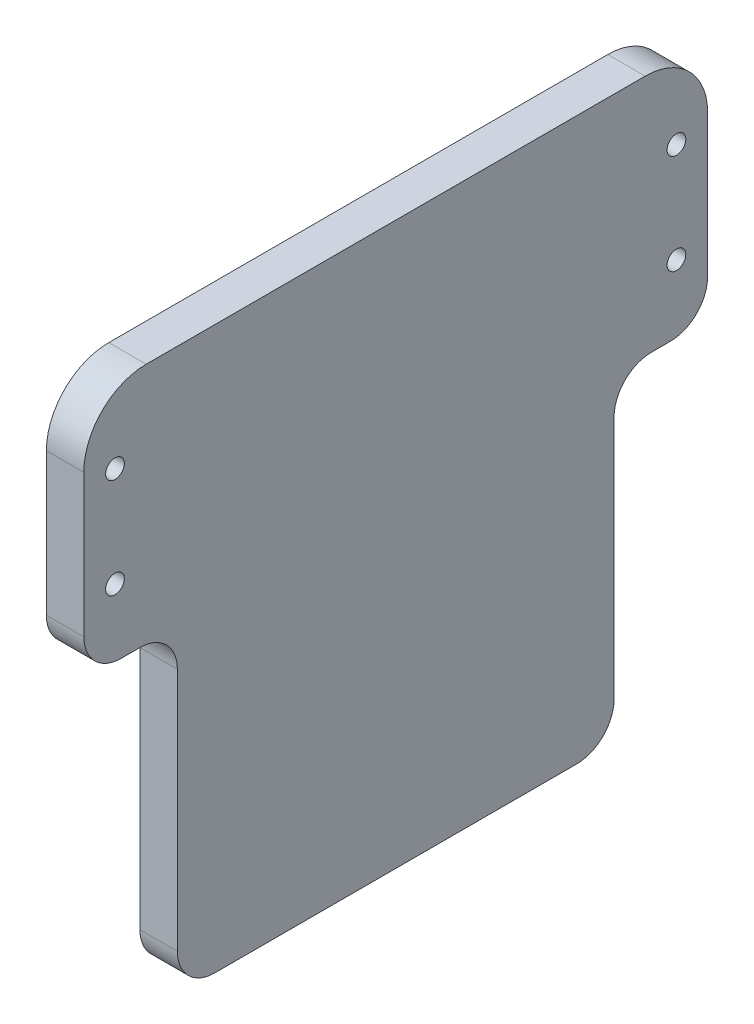
ISO-10303-21;
HEADER;
FILE_DESCRIPTION(('STEP AP214'),'2;1');
FILE_NAME('part.step','',(''),(''),'','','');
FILE_SCHEMA(('AUTOMOTIVE_DESIGN { 1 0 10303 214 1 1 1 1 }'));
ENDSEC;
DATA;
#1=APPLICATION_CONTEXT('core data for automotive mechanical design processes');
#2=APPLICATION_PROTOCOL_DEFINITION('international standard','automotive_design',2000,#1);
#3=PRODUCT_CONTEXT('',#1,'mechanical');
#4=PRODUCT('Part','Part','',(#3));
#5=PRODUCT_RELATED_PRODUCT_CATEGORY('part','',(#4));
#6=PRODUCT_DEFINITION_FORMATION('','',#4);
#7=PRODUCT_DEFINITION_CONTEXT('part definition',#1,'design');
#8=PRODUCT_DEFINITION('design','',#6,#7);
#9=PRODUCT_DEFINITION_SHAPE('','',#8);
#10=(LENGTH_UNIT() NAMED_UNIT(*) SI_UNIT(.MILLI.,.METRE.));
#11=(NAMED_UNIT(*) PLANE_ANGLE_UNIT() SI_UNIT($,.RADIAN.));
#12=(NAMED_UNIT(*) SI_UNIT($,.STERADIAN.) SOLID_ANGLE_UNIT());
#13=UNCERTAINTY_MEASURE_WITH_UNIT(LENGTH_MEASURE(1.E-05),#10,'distance_accuracy_value','');
#14=(GEOMETRIC_REPRESENTATION_CONTEXT(3) GLOBAL_UNCERTAINTY_ASSIGNED_CONTEXT((#13)) GLOBAL_UNIT_ASSIGNED_CONTEXT((#10,
#11,#12)) REPRESENTATION_CONTEXT('',''));
#15=CARTESIAN_POINT('',(0.,0.,0.));
#16=DIRECTION('',(0.,0.,1.));
#17=DIRECTION('',(1.,0.,0.));
#18=AXIS2_PLACEMENT_3D('',#15,#16,#17);
#19=CARTESIAN_POINT('',(3.,-97.5205180197301,30.));
#20=DIRECTION('',(0.,-1.,0.));
#21=DIRECTION('',(0.,0.,-1.));
#22=AXIS2_PLACEMENT_3D('',#19,#20,#21);
#23=PLANE('',#22);
#24=DIRECTION('',(0.,0.,1.));
#25=VECTOR('',#24,1.);
#26=CARTESIAN_POINT('',(3.,-97.5205180197301,30.));
#27=LINE('',#26,#25);
#28=CARTESIAN_POINT('',(3.,-97.5205180197301,-20.));
#29=VERTEX_POINT('',#28);
#30=CARTESIAN_POINT('',(3.,-97.5205180197301,20.));
#31=VERTEX_POINT('',#30);
#32=EDGE_CURVE('E241',#29,#31,#27,.T.);
#33=ORIENTED_EDGE('',*,*,#32,.F.);
#34=DIRECTION('',(1.,0.,0.));
#35=VECTOR('',#34,1.);
#36=CARTESIAN_POINT('',(3.,-97.5205180197301,-20.));
#37=LINE('',#36,#35);
#38=CARTESIAN_POINT('',(0.,-97.5205180197301,-20.));
#39=VERTEX_POINT('',#38);
#40=EDGE_CURVE('E52',#29,#39,#37,.F.);
#41=ORIENTED_EDGE('',*,*,#40,.T.);
#42=DIRECTION('',(0.,0.,1.));
#43=VECTOR('',#42,1.);
#44=CARTESIAN_POINT('',(0.,-97.5205180197301,30.));
#45=LINE('',#44,#43);
#46=CARTESIAN_POINT('',(0.,-97.5205180197301,20.));
#47=VERTEX_POINT('',#46);
#48=EDGE_CURVE('E238',#39,#47,#45,.T.);
#49=ORIENTED_EDGE('',*,*,#48,.T.);
#50=DIRECTION('',(1.,0.,0.));
#51=VECTOR('',#50,1.);
#52=CARTESIAN_POINT('',(3.,-97.5205180197301,20.));
#53=LINE('',#52,#51);
#54=EDGE_CURVE('E292',#47,#31,#53,.T.);
#55=ORIENTED_EDGE('',*,*,#54,.T.);
#56=EDGE_LOOP('',(#33,#41,#49,#55));
#57=FACE_BOUND('',#56,.T.);
#58=ADVANCED_FACE('F44',(#57),#23,.F.);
#59=CARTESIAN_POINT('',(3.,-121.52051801973,17.5));
#60=DIRECTION('',(0.,0.,-1.));
#61=DIRECTION('',(0.,1.,0.));
#62=AXIS2_PLACEMENT_3D('',#59,#60,#61);
#63=PLANE('',#62);
#64=DIRECTION('',(-1.,0.,0.));
#65=VECTOR('',#64,1.);
#66=CARTESIAN_POINT('',(3.,-139.52051801973,17.5));
#67=LINE('',#66,#65);
#68=CARTESIAN_POINT('',(3.,-139.52051801973,17.5));
#69=VERTEX_POINT('',#68);
#70=CARTESIAN_POINT('',(0.,-139.52051801973,17.5));
#71=VERTEX_POINT('',#70);
#72=EDGE_CURVE('E267',#69,#71,#67,.T.);
#73=ORIENTED_EDGE('',*,*,#72,.F.);
#74=DIRECTION('',(0.,-1.,0.));
#75=VECTOR('',#74,1.);
#76=CARTESIAN_POINT('',(3.,-121.52051801973,17.5));
#77=LINE('',#76,#75);
#78=CARTESIAN_POINT('',(3.,-119.936716506826,17.5));
#79=VERTEX_POINT('',#78);
#80=EDGE_CURVE('E243',#79,#69,#77,.T.);
#81=ORIENTED_EDGE('',*,*,#80,.F.);
#82=DIRECTION('',(1.,0.,0.));
#83=VECTOR('',#82,1.);
#84=CARTESIAN_POINT('',(-7.,-119.936716506826,17.5));
#85=LINE('',#84,#83);
#86=CARTESIAN_POINT('',(0.,-119.936716506826,17.5));
#87=VERTEX_POINT('',#86);
#88=EDGE_CURVE('E207',#87,#79,#85,.T.);
#89=ORIENTED_EDGE('',*,*,#88,.F.);
#90=DIRECTION('',(0.,-1.,0.));
#91=VECTOR('',#90,1.);
#92=CARTESIAN_POINT('',(0.,-121.52051801973,17.5));
#93=LINE('',#92,#91);
#94=EDGE_CURVE('E251',#87,#71,#93,.T.);
#95=ORIENTED_EDGE('',*,*,#94,.T.);
#96=EDGE_LOOP('',(#73,#81,#89,#95));
#97=FACE_BOUND('',#96,.T.);
#98=ADVANCED_FACE('F326',(#97),#63,.F.);
#99=CARTESIAN_POINT('',(3.,-139.52051801973,14.5));
#100=DIRECTION('',(-1.,0.,0.));
#101=DIRECTION('',(0.,0.,1.));
#102=AXIS2_PLACEMENT_3D('',#99,#100,#101);
#103=CYLINDRICAL_SURFACE('',#102,3.);
#104=CARTESIAN_POINT('',(0.,-139.52051801973,14.5));
#105=DIRECTION('',(1.,0.,0.));
#106=DIRECTION('',(0.,0.,1.));
#107=AXIS2_PLACEMENT_3D('',#104,#105,#106);
#108=CIRCLE('',#107,3.);
#109=CARTESIAN_POINT('',(0.,-142.52051801973,14.5));
#110=VERTEX_POINT('',#109);
#111=EDGE_CURVE('E253',#71,#110,#108,.T.);
#112=ORIENTED_EDGE('',*,*,#111,.T.);
#113=DIRECTION('',(-1.,0.,0.));
#114=VECTOR('',#113,1.);
#115=CARTESIAN_POINT('',(3.,-142.52051801973,14.5));
#116=LINE('',#115,#114);
#117=CARTESIAN_POINT('',(3.,-142.52051801973,14.5));
#118=VERTEX_POINT('',#117);
#119=EDGE_CURVE('E264',#118,#110,#116,.T.);
#120=ORIENTED_EDGE('',*,*,#119,.F.);
#121=CARTESIAN_POINT('',(3.,-139.52051801973,14.5));
#122=DIRECTION('',(1.,0.,0.));
#123=DIRECTION('',(0.,0.,1.));
#124=AXIS2_PLACEMENT_3D('',#121,#122,#123);
#125=CIRCLE('',#124,3.);
#126=EDGE_CURVE('E245',#69,#118,#125,.T.);
#127=ORIENTED_EDGE('',*,*,#126,.F.);
#128=ORIENTED_EDGE('',*,*,#72,.T.);
#129=EDGE_LOOP('',(#112,#120,#127,#128));
#130=FACE_BOUND('',#129,.T.);
#131=ADVANCED_FACE('F331',(#130),#103,.T.);
#132=CARTESIAN_POINT('',(3.,-142.52051801973,-14.5));
#133=DIRECTION('',(0.,1.,0.));
#134=DIRECTION('',(0.,0.,1.));
#135=AXIS2_PLACEMENT_3D('',#132,#133,#134);
#136=PLANE('',#135);
#137=DIRECTION('',(0.,0.,-1.));
#138=VECTOR('',#137,1.);
#139=CARTESIAN_POINT('',(0.,-142.52051801973,-14.5));
#140=LINE('',#139,#138);
#141=CARTESIAN_POINT('',(0.,-142.52051801973,-14.5));
#142=VERTEX_POINT('',#141);
#143=EDGE_CURVE('E255',#110,#142,#140,.T.);
#144=ORIENTED_EDGE('',*,*,#143,.T.);
#145=DIRECTION('',(-1.,0.,0.));
#146=VECTOR('',#145,1.);
#147=CARTESIAN_POINT('',(3.,-142.52051801973,-14.5));
#148=LINE('',#147,#146);
#149=CARTESIAN_POINT('',(3.,-142.52051801973,-14.5));
#150=VERTEX_POINT('',#149);
#151=EDGE_CURVE('E261',#150,#142,#148,.T.);
#152=ORIENTED_EDGE('',*,*,#151,.F.);
#153=DIRECTION('',(0.,0.,-1.));
#154=VECTOR('',#153,1.);
#155=CARTESIAN_POINT('',(3.,-142.52051801973,-14.5));
#156=LINE('',#155,#154);
#157=EDGE_CURVE('E247',#118,#150,#156,.T.);
#158=ORIENTED_EDGE('',*,*,#157,.F.);
#159=ORIENTED_EDGE('',*,*,#119,.T.);
#160=EDGE_LOOP('',(#144,#152,#158,#159));
#161=FACE_BOUND('',#160,.T.);
#162=ADVANCED_FACE('F337',(#161),#136,.F.);
#163=CARTESIAN_POINT('',(3.,-139.52051801973,-14.5));
#164=DIRECTION('',(-1.,0.,0.));
#165=DIRECTION('',(0.,0.,1.));
#166=AXIS2_PLACEMENT_3D('',#163,#164,#165);
#167=CYLINDRICAL_SURFACE('',#166,3.);
#168=CARTESIAN_POINT('',(0.,-139.52051801973,-14.5));
#169=DIRECTION('',(1.,0.,0.));
#170=DIRECTION('',(0.,0.,-1.));
#171=AXIS2_PLACEMENT_3D('',#168,#169,#170);
#172=CIRCLE('',#171,3.);
#173=CARTESIAN_POINT('',(0.,-139.52051801973,-17.5));
#174=VERTEX_POINT('',#173);
#175=EDGE_CURVE('E257',#142,#174,#172,.T.);
#176=ORIENTED_EDGE('',*,*,#175,.T.);
#177=DIRECTION('',(-1.,0.,0.));
#178=VECTOR('',#177,1.);
#179=CARTESIAN_POINT('',(3.,-139.52051801973,-17.5));
#180=LINE('',#179,#178);
#181=CARTESIAN_POINT('',(3.,-139.52051801973,-17.5));
#182=VERTEX_POINT('',#181);
#183=EDGE_CURVE('E166',#182,#174,#180,.T.);
#184=ORIENTED_EDGE('',*,*,#183,.F.);
#185=CARTESIAN_POINT('',(3.,-139.52051801973,-14.5));
#186=DIRECTION('',(1.,0.,0.));
#187=DIRECTION('',(0.,0.,-1.));
#188=AXIS2_PLACEMENT_3D('',#185,#186,#187);
#189=CIRCLE('',#188,3.);
#190=EDGE_CURVE('E162',#150,#182,#189,.T.);
#191=ORIENTED_EDGE('',*,*,#190,.F.);
#192=ORIENTED_EDGE('',*,*,#151,.T.);
#193=EDGE_LOOP('',(#176,#184,#191,#192));
#194=FACE_BOUND('',#193,.T.);
#195=ADVANCED_FACE('F341',(#194),#167,.T.);
#196=CARTESIAN_POINT('',(3.,-121.52051801973,-17.5));
#197=DIRECTION('',(0.,0.,1.));
#198=DIRECTION('',(1.,0.,0.));
#199=AXIS2_PLACEMENT_3D('',#196,#197,#198);
#200=PLANE('',#199);
#201=DIRECTION('',(0.,1.,0.));
#202=VECTOR('',#201,1.);
#203=CARTESIAN_POINT('',(0.,-121.52051801973,-17.5));
#204=LINE('',#203,#202);
#205=CARTESIAN_POINT('',(0.,-119.936716506826,-17.5));
#206=VERTEX_POINT('',#205);
#207=EDGE_CURVE('E172',#174,#206,#204,.T.);
#208=ORIENTED_EDGE('',*,*,#207,.T.);
#209=DIRECTION('',(1.,0.,0.));
#210=VECTOR('',#209,1.);
#211=CARTESIAN_POINT('',(-7.,-119.936716506826,-17.5));
#212=LINE('',#211,#210);
#213=CARTESIAN_POINT('',(3.,-119.936716506826,-17.5));
#214=VERTEX_POINT('',#213);
#215=EDGE_CURVE('E169',#206,#214,#212,.T.);
#216=ORIENTED_EDGE('',*,*,#215,.T.);
#217=DIRECTION('',(0.,1.,0.));
#218=VECTOR('',#217,1.);
#219=CARTESIAN_POINT('',(3.,-121.52051801973,-17.5));
#220=LINE('',#219,#218);
#221=EDGE_CURVE('E154',#182,#214,#220,.T.);
#222=ORIENTED_EDGE('',*,*,#221,.F.);
#223=ORIENTED_EDGE('',*,*,#183,.T.);
#224=EDGE_LOOP('',(#208,#216,#222,#223));
#225=FACE_BOUND('',#224,.T.);
#226=ADVANCED_FACE('F170',(#225),#200,.F.);
#227=CARTESIAN_POINT('',(3.,-109.52051801973,-22.));
#228=DIRECTION('',(1.,0.,0.));
#229=DIRECTION('',(0.,0.,-1.));
#230=AXIS2_PLACEMENT_3D('',#227,#228,#229);
#231=PLANE('',#230);
#232=DIRECTION('',(0.,-1.,0.));
#233=VECTOR('',#232,1.);
#234=CARTESIAN_POINT('',(3.,-97.5205180197301,-25.));
#235=LINE('',#234,#233);
#236=CARTESIAN_POINT('',(3.,-102.52051801973,-25.));
#237=VERTEX_POINT('',#236);
#238=CARTESIAN_POINT('',(3.,-113.936716506826,-25.));
#239=VERTEX_POINT('',#238);
#240=EDGE_CURVE('E182',#237,#239,#235,.T.);
#241=ORIENTED_EDGE('',*,*,#240,.F.);
#242=CARTESIAN_POINT('',(3.,-102.52051801973,-20.));
#243=DIRECTION('',(1.,0.,0.));
#244=DIRECTION('',(0.,0.,-1.));
#245=AXIS2_PLACEMENT_3D('',#242,#243,#244);
#246=CIRCLE('',#245,5.);
#247=EDGE_CURVE('E66',#237,#29,#246,.T.);
#248=ORIENTED_EDGE('',*,*,#247,.T.);
#249=ORIENTED_EDGE('',*,*,#32,.T.);
#250=CARTESIAN_POINT('',(3.,-102.52051801973,20.));
#251=DIRECTION('',(1.,0.,0.));
#252=DIRECTION('',(0.,0.,-1.));
#253=AXIS2_PLACEMENT_3D('',#250,#251,#252);
#254=CIRCLE('',#253,5.);
#255=CARTESIAN_POINT('',(3.,-102.52051801973,25.));
#256=VERTEX_POINT('',#255);
#257=EDGE_CURVE('E295',#31,#256,#254,.T.);
#258=ORIENTED_EDGE('',*,*,#257,.T.);
#259=DIRECTION('',(0.,1.,0.));
#260=VECTOR('',#259,1.);
#261=CARTESIAN_POINT('',(3.,-97.5205180197301,25.));
#262=LINE('',#261,#260);
#263=CARTESIAN_POINT('',(3.,-113.936716506826,25.));
#264=VERTEX_POINT('',#263);
#265=EDGE_CURVE('E204',#264,#256,#262,.T.);
#266=ORIENTED_EDGE('',*,*,#265,.F.);
#267=CARTESIAN_POINT('',(3.,-113.936716506826,22.));
#268=DIRECTION('',(-1.,0.,0.));
#269=DIRECTION('',(0.,0.,1.));
#270=AXIS2_PLACEMENT_3D('',#267,#268,#269);
#271=CIRCLE('',#270,3.);
#272=CARTESIAN_POINT('',(3.,-116.936716506826,22.));
#273=VERTEX_POINT('',#272);
#274=EDGE_CURVE('E201',#273,#264,#271,.T.);
#275=ORIENTED_EDGE('',*,*,#274,.F.);
#276=DIRECTION('',(0.,0.,1.));
#277=VECTOR('',#276,1.);
#278=CARTESIAN_POINT('',(3.,-116.936716506826,20.5));
#279=LINE('',#278,#277);
#280=CARTESIAN_POINT('',(3.,-116.936716506826,20.5));
#281=VERTEX_POINT('',#280);
#282=EDGE_CURVE('E198',#281,#273,#279,.T.);
#283=ORIENTED_EDGE('',*,*,#282,.F.);
#284=CARTESIAN_POINT('',(3.,-119.936716506826,20.5));
#285=DIRECTION('',(1.,0.,0.));
#286=DIRECTION('',(0.,0.,-1.));
#287=AXIS2_PLACEMENT_3D('',#284,#285,#286);
#288=CIRCLE('',#287,3.);
#289=EDGE_CURVE('E191',#79,#281,#288,.T.);
#290=ORIENTED_EDGE('',*,*,#289,.F.);
#291=ORIENTED_EDGE('',*,*,#80,.T.);
#292=ORIENTED_EDGE('',*,*,#126,.T.);
#293=ORIENTED_EDGE('',*,*,#157,.T.);
#294=ORIENTED_EDGE('',*,*,#190,.T.);
#295=ORIENTED_EDGE('',*,*,#221,.T.);
#296=CARTESIAN_POINT('',(3.,-119.936716506826,-20.5));
#297=DIRECTION('',(1.,0.,0.));
#298=DIRECTION('',(0.,0.,1.));
#299=AXIS2_PLACEMENT_3D('',#296,#297,#298);
#300=CIRCLE('',#299,3.);
#301=CARTESIAN_POINT('',(3.,-116.936716506826,-20.5));
#302=VERTEX_POINT('',#301);
#303=EDGE_CURVE('E160',#302,#214,#300,.T.);
#304=ORIENTED_EDGE('',*,*,#303,.F.);
#305=DIRECTION('',(0.,0.,1.));
#306=VECTOR('',#305,1.);
#307=CARTESIAN_POINT('',(3.,-116.936716506826,-20.5));
#308=LINE('',#307,#306);
#309=CARTESIAN_POINT('',(3.,-116.936716506826,-22.));
#310=VERTEX_POINT('',#309);
#311=EDGE_CURVE('E176',#310,#302,#308,.T.);
#312=ORIENTED_EDGE('',*,*,#311,.F.);
#313=CARTESIAN_POINT('',(3.,-113.936716506826,-22.));
#314=DIRECTION('',(-1.,0.,0.));
#315=DIRECTION('',(0.,0.,-1.));
#316=AXIS2_PLACEMENT_3D('',#313,#314,#315);
#317=CIRCLE('',#316,2.99999999999999);
#318=EDGE_CURVE('E184',#239,#310,#317,.T.);
#319=ORIENTED_EDGE('',*,*,#318,.F.);
#320=EDGE_LOOP('',(#241,#248,#249,#258,#266,#275,#283,#290,#291,#292,#293,#294,#295,#304,#312,#319));
#321=FACE_BOUND('',#320,.T.);
#322=CARTESIAN_POINT('',(3.,-111.52051801973,22.5));
#323=DIRECTION('',(1.,0.,0.));
#324=DIRECTION('',(0.,0.,1.));
#325=AXIS2_PLACEMENT_3D('',#322,#323,#324);
#326=CIRCLE('',#325,0.750000000000002);
#327=CARTESIAN_POINT('',(3.,-111.52051801973,23.25));
#328=VERTEX_POINT('',#327);
#329=EDGE_CURVE('E221',#328,#328,#326,.T.);
#330=ORIENTED_EDGE('',*,*,#329,.F.);
#331=EDGE_LOOP('',(#330));
#332=FACE_BOUND('',#331,.T.);
#333=CARTESIAN_POINT('',(3.,-111.52051801973,-22.5));
#334=DIRECTION('',(1.,0.,0.));
#335=DIRECTION('',(0.,0.,-1.));
#336=AXIS2_PLACEMENT_3D('',#333,#334,#335);
#337=CIRCLE('',#336,0.750000000000002);
#338=CARTESIAN_POINT('',(3.,-111.52051801973,-23.25));
#339=VERTEX_POINT('',#338);
#340=EDGE_CURVE('E227',#339,#339,#337,.T.);
#341=ORIENTED_EDGE('',*,*,#340,.F.);
#342=EDGE_LOOP('',(#341));
#343=FACE_BOUND('',#342,.T.);
#344=CARTESIAN_POINT('',(3.,-103.52051801973,-22.5));
#345=DIRECTION('',(1.,0.,0.));
#346=DIRECTION('',(0.,0.,1.));
#347=AXIS2_PLACEMENT_3D('',#344,#345,#346);
#348=CIRCLE('',#347,0.750000000000002);
#349=CARTESIAN_POINT('',(3.,-103.52051801973,-21.75));
#350=VERTEX_POINT('',#349);
#351=EDGE_CURVE('E210',#350,#350,#348,.T.);
#352=ORIENTED_EDGE('',*,*,#351,.F.);
#353=EDGE_LOOP('',(#352));
#354=FACE_BOUND('',#353,.T.);
#355=CARTESIAN_POINT('',(3.,-103.52051801973,22.5));
#356=DIRECTION('',(1.,0.,0.));
#357=DIRECTION('',(0.,0.,-1.));
#358=AXIS2_PLACEMENT_3D('',#355,#356,#357);
#359=CIRCLE('',#358,0.750000000000002);
#360=CARTESIAN_POINT('',(3.,-103.52051801973,21.75));
#361=VERTEX_POINT('',#360);
#362=EDGE_CURVE('E220',#361,#361,#359,.T.);
#363=ORIENTED_EDGE('',*,*,#362,.F.);
#364=EDGE_LOOP('',(#363));
#365=FACE_BOUND('',#364,.T.);
#366=ADVANCED_FACE('F156',(#321,#332,#343,#354,#365),#231,.T.);
#367=CARTESIAN_POINT('',(0.,-109.52051801973,-22.));
#368=DIRECTION('',(1.,0.,0.));
#369=DIRECTION('',(0.,0.,-1.));
#370=AXIS2_PLACEMENT_3D('',#367,#368,#369);
#371=PLANE('',#370);
#372=CARTESIAN_POINT('',(0.,-111.52051801973,22.5));
#373=DIRECTION('',(1.,0.,0.));
#374=DIRECTION('',(0.,0.,1.));
#375=AXIS2_PLACEMENT_3D('',#372,#373,#374);
#376=CIRCLE('',#375,0.750000000000002);
#377=CARTESIAN_POINT('',(0.,-111.52051801973,23.25));
#378=VERTEX_POINT('',#377);
#379=EDGE_CURVE('E217',#378,#378,#376,.T.);
#380=ORIENTED_EDGE('',*,*,#379,.T.);
#381=EDGE_LOOP('',(#380));
#382=FACE_BOUND('',#381,.T.);
#383=CARTESIAN_POINT('',(0.,-111.52051801973,-22.5));
#384=DIRECTION('',(1.,0.,0.));
#385=DIRECTION('',(0.,0.,-1.));
#386=AXIS2_PLACEMENT_3D('',#383,#384,#385);
#387=CIRCLE('',#386,0.750000000000002);
#388=CARTESIAN_POINT('',(0.,-111.52051801973,-23.25));
#389=VERTEX_POINT('',#388);
#390=EDGE_CURVE('E224',#389,#389,#387,.T.);
#391=ORIENTED_EDGE('',*,*,#390,.T.);
#392=EDGE_LOOP('',(#391));
#393=FACE_BOUND('',#392,.T.);
#394=CARTESIAN_POINT('',(0.,-103.52051801973,-22.5));
#395=DIRECTION('',(1.,0.,0.));
#396=DIRECTION('',(0.,0.,1.));
#397=AXIS2_PLACEMENT_3D('',#394,#395,#396);
#398=CIRCLE('',#397,0.750000000000002);
#399=CARTESIAN_POINT('',(0.,-103.52051801973,-21.75));
#400=VERTEX_POINT('',#399);
#401=EDGE_CURVE('E230',#400,#400,#398,.T.);
#402=ORIENTED_EDGE('',*,*,#401,.T.);
#403=EDGE_LOOP('',(#402));
#404=FACE_BOUND('',#403,.T.);
#405=CARTESIAN_POINT('',(0.,-103.52051801973,22.5));
#406=DIRECTION('',(1.,0.,0.));
#407=DIRECTION('',(0.,0.,-1.));
#408=AXIS2_PLACEMENT_3D('',#405,#406,#407);
#409=CIRCLE('',#408,0.750000000000002);
#410=CARTESIAN_POINT('',(0.,-103.52051801973,21.75));
#411=VERTEX_POINT('',#410);
#412=EDGE_CURVE('E235',#411,#411,#409,.T.);
#413=ORIENTED_EDGE('',*,*,#412,.T.);
#414=EDGE_LOOP('',(#413));
#415=FACE_BOUND('',#414,.T.);
#416=ORIENTED_EDGE('',*,*,#48,.F.);
#417=CARTESIAN_POINT('',(0.,-102.52051801973,-20.));
#418=DIRECTION('',(1.,0.,0.));
#419=DIRECTION('',(0.,0.,-1.));
#420=AXIS2_PLACEMENT_3D('',#417,#418,#419);
#421=CIRCLE('',#420,5.);
#422=CARTESIAN_POINT('',(0.,-102.52051801973,-25.));
#423=VERTEX_POINT('',#422);
#424=EDGE_CURVE('E13',#39,#423,#421,.F.);
#425=ORIENTED_EDGE('',*,*,#424,.T.);
#426=DIRECTION('',(0.,-1.,0.));
#427=VECTOR('',#426,1.);
#428=CARTESIAN_POINT('',(0.,-109.52051801973,-25.));
#429=LINE('',#428,#427);
#430=CARTESIAN_POINT('',(0.,-113.936716506826,-25.));
#431=VERTEX_POINT('',#430);
#432=EDGE_CURVE('E290',#423,#431,#429,.T.);
#433=ORIENTED_EDGE('',*,*,#432,.T.);
#434=CARTESIAN_POINT('',(0.,-113.936716506826,-22.));
#435=DIRECTION('',(1.,0.,0.));
#436=DIRECTION('',(0.,0.,-1.));
#437=AXIS2_PLACEMENT_3D('',#434,#435,#436);
#438=CIRCLE('',#437,2.99999999999999);
#439=CARTESIAN_POINT('',(0.,-116.936716506826,-22.));
#440=VERTEX_POINT('',#439);
#441=EDGE_CURVE('E287',#431,#440,#438,.F.);
#442=ORIENTED_EDGE('',*,*,#441,.T.);
#443=DIRECTION('',(0.,0.,1.));
#444=VECTOR('',#443,1.);
#445=CARTESIAN_POINT('',(0.,-116.936716506826,-22.));
#446=LINE('',#445,#444);
#447=CARTESIAN_POINT('',(0.,-116.936716506826,-20.5));
#448=VERTEX_POINT('',#447);
#449=EDGE_CURVE('E284',#440,#448,#446,.T.);
#450=ORIENTED_EDGE('',*,*,#449,.T.);
#451=CARTESIAN_POINT('',(0.,-119.936716506826,-20.5));
#452=DIRECTION('',(1.,0.,0.));
#453=DIRECTION('',(0.,0.,-1.));
#454=AXIS2_PLACEMENT_3D('',#451,#452,#453);
#455=CIRCLE('',#454,3.);
#456=EDGE_CURVE('E282',#448,#206,#455,.T.);
#457=ORIENTED_EDGE('',*,*,#456,.T.);
#458=ORIENTED_EDGE('',*,*,#207,.F.);
#459=ORIENTED_EDGE('',*,*,#175,.F.);
#460=ORIENTED_EDGE('',*,*,#143,.F.);
#461=ORIENTED_EDGE('',*,*,#111,.F.);
#462=ORIENTED_EDGE('',*,*,#94,.F.);
#463=CARTESIAN_POINT('',(0.,-119.936716506826,20.5));
#464=DIRECTION('',(1.,0.,0.));
#465=DIRECTION('',(0.,0.,-1.));
#466=AXIS2_PLACEMENT_3D('',#463,#464,#465);
#467=CIRCLE('',#466,3.);
#468=CARTESIAN_POINT('',(0.,-116.936716506826,20.5));
#469=VERTEX_POINT('',#468);
#470=EDGE_CURVE('E270',#87,#469,#467,.T.);
#471=ORIENTED_EDGE('',*,*,#470,.T.);
#472=DIRECTION('',(0.,0.,1.));
#473=VECTOR('',#472,1.);
#474=CARTESIAN_POINT('',(0.,-116.936716506826,-22.));
#475=LINE('',#474,#473);
#476=CARTESIAN_POINT('',(0.,-116.936716506826,22.));
#477=VERTEX_POINT('',#476);
#478=EDGE_CURVE('E273',#469,#477,#475,.T.);
#479=ORIENTED_EDGE('',*,*,#478,.T.);
#480=CARTESIAN_POINT('',(0.,-113.936716506826,22.));
#481=DIRECTION('',(1.,0.,0.));
#482=DIRECTION('',(0.,0.,-1.));
#483=AXIS2_PLACEMENT_3D('',#480,#481,#482);
#484=CIRCLE('',#483,3.);
#485=CARTESIAN_POINT('',(0.,-113.936716506826,25.));
#486=VERTEX_POINT('',#485);
#487=EDGE_CURVE('E276',#477,#486,#484,.F.);
#488=ORIENTED_EDGE('',*,*,#487,.T.);
#489=DIRECTION('',(0.,1.,0.));
#490=VECTOR('',#489,1.);
#491=CARTESIAN_POINT('',(0.,-109.52051801973,25.));
#492=LINE('',#491,#490);
#493=CARTESIAN_POINT('',(0.,-102.52051801973,25.));
#494=VERTEX_POINT('',#493);
#495=EDGE_CURVE('E279',#486,#494,#492,.T.);
#496=ORIENTED_EDGE('',*,*,#495,.T.);
#497=CARTESIAN_POINT('',(0.,-102.52051801973,20.));
#498=DIRECTION('',(1.,0.,0.));
#499=DIRECTION('',(0.,0.,-1.));
#500=AXIS2_PLACEMENT_3D('',#497,#498,#499);
#501=CIRCLE('',#500,5.);
#502=EDGE_CURVE('E299',#494,#47,#501,.F.);
#503=ORIENTED_EDGE('',*,*,#502,.T.);
#504=EDGE_LOOP('',(#416,#425,#433,#442,#450,#457,#458,#459,#460,#461,#462,#471,#479,#488,#496,#503));
#505=FACE_BOUND('',#504,.T.);
#506=ADVANCED_FACE('F318',(#382,#393,#404,#415,#505),#371,.F.);
#507=CARTESIAN_POINT('',(0.,-103.52051801973,22.5));
#508=DIRECTION('',(1.,0.,0.));
#509=DIRECTION('',(0.,0.,-1.));
#510=AXIS2_PLACEMENT_3D('',#507,#508,#509);
#511=CYLINDRICAL_SURFACE('',#510,0.750000000000002);
#512=ORIENTED_EDGE('',*,*,#412,.F.);
#513=EDGE_LOOP('',(#512));
#514=FACE_BOUND('',#513,.T.);
#515=ORIENTED_EDGE('',*,*,#362,.T.);
#516=EDGE_LOOP('',(#515));
#517=FACE_BOUND('',#516,.T.);
#518=ADVANCED_FACE('F350',(#514,#517),#511,.F.);
#519=CARTESIAN_POINT('',(0.,-103.52051801973,-22.5));
#520=DIRECTION('',(1.,0.,0.));
#521=DIRECTION('',(0.,0.,-1.));
#522=AXIS2_PLACEMENT_3D('',#519,#520,#521);
#523=CYLINDRICAL_SURFACE('',#522,0.750000000000002);
#524=ORIENTED_EDGE('',*,*,#401,.F.);
#525=EDGE_LOOP('',(#524));
#526=FACE_BOUND('',#525,.T.);
#527=ORIENTED_EDGE('',*,*,#351,.T.);
#528=EDGE_LOOP('',(#527));
#529=FACE_BOUND('',#528,.T.);
#530=ADVANCED_FACE('F356',(#526,#529),#523,.F.);
#531=CARTESIAN_POINT('',(0.,-111.52051801973,-22.5));
#532=DIRECTION('',(1.,0.,0.));
#533=DIRECTION('',(0.,0.,-1.));
#534=AXIS2_PLACEMENT_3D('',#531,#532,#533);
#535=CYLINDRICAL_SURFACE('',#534,0.750000000000002);
#536=ORIENTED_EDGE('',*,*,#390,.F.);
#537=EDGE_LOOP('',(#536));
#538=FACE_BOUND('',#537,.T.);
#539=ORIENTED_EDGE('',*,*,#340,.T.);
#540=EDGE_LOOP('',(#539));
#541=FACE_BOUND('',#540,.T.);
#542=ADVANCED_FACE('F360',(#538,#541),#535,.F.);
#543=CARTESIAN_POINT('',(0.,-111.52051801973,22.5));
#544=DIRECTION('',(1.,0.,0.));
#545=DIRECTION('',(0.,0.,-1.));
#546=AXIS2_PLACEMENT_3D('',#543,#544,#545);
#547=CYLINDRICAL_SURFACE('',#546,0.750000000000002);
#548=ORIENTED_EDGE('',*,*,#379,.F.);
#549=EDGE_LOOP('',(#548));
#550=FACE_BOUND('',#549,.T.);
#551=ORIENTED_EDGE('',*,*,#329,.T.);
#552=EDGE_LOOP('',(#551));
#553=FACE_BOUND('',#552,.T.);
#554=ADVANCED_FACE('F364',(#550,#553),#547,.F.);
#555=CARTESIAN_POINT('',(-7.,-97.5205180197301,25.));
#556=DIRECTION('',(0.,0.,-1.));
#557=DIRECTION('',(-1.,0.,0.));
#558=AXIS2_PLACEMENT_3D('',#555,#556,#557);
#559=PLANE('',#558);
#560=ORIENTED_EDGE('',*,*,#265,.T.);
#561=DIRECTION('',(1.,0.,0.));
#562=VECTOR('',#561,1.);
#563=CARTESIAN_POINT('',(-7.,-102.52051801973,25.));
#564=LINE('',#563,#562);
#565=EDGE_CURVE('E297',#256,#494,#564,.F.);
#566=ORIENTED_EDGE('',*,*,#565,.T.);
#567=ORIENTED_EDGE('',*,*,#495,.F.);
#568=DIRECTION('',(1.,0.,0.));
#569=VECTOR('',#568,1.);
#570=CARTESIAN_POINT('',(-7.,-113.936716506826,25.));
#571=LINE('',#570,#569);
#572=EDGE_CURVE('E208',#486,#264,#571,.T.);
#573=ORIENTED_EDGE('',*,*,#572,.T.);
#574=EDGE_LOOP('',(#560,#566,#567,#573));
#575=FACE_BOUND('',#574,.T.);
#576=ADVANCED_FACE('F368',(#575),#559,.F.);
#577=CARTESIAN_POINT('',(-7.,-113.936716506826,22.));
#578=DIRECTION('',(1.,0.,0.));
#579=DIRECTION('',(0.,0.,-1.));
#580=AXIS2_PLACEMENT_3D('',#577,#578,#579);
#581=CYLINDRICAL_SURFACE('',#580,3.);
#582=DIRECTION('',(1.,0.,0.));
#583=VECTOR('',#582,1.);
#584=CARTESIAN_POINT('',(-7.,-116.936716506826,22.));
#585=LINE('',#584,#583);
#586=EDGE_CURVE('E211',#477,#273,#585,.T.);
#587=ORIENTED_EDGE('',*,*,#586,.T.);
#588=ORIENTED_EDGE('',*,*,#274,.T.);
#589=ORIENTED_EDGE('',*,*,#572,.F.);
#590=ORIENTED_EDGE('',*,*,#487,.F.);
#591=EDGE_LOOP('',(#587,#588,#589,#590));
#592=FACE_BOUND('',#591,.T.);
#593=ADVANCED_FACE('F377',(#592),#581,.T.);
#594=CARTESIAN_POINT('',(-7.,-116.936716506826,20.5));
#595=DIRECTION('',(0.,1.,0.));
#596=DIRECTION('',(0.,0.,1.));
#597=AXIS2_PLACEMENT_3D('',#594,#595,#596);
#598=PLANE('',#597);
#599=DIRECTION('',(1.,0.,0.));
#600=VECTOR('',#599,1.);
#601=CARTESIAN_POINT('',(-7.,-116.936716506826,20.5));
#602=LINE('',#601,#600);
#603=EDGE_CURVE('E213',#469,#281,#602,.T.);
#604=ORIENTED_EDGE('',*,*,#603,.T.);
#605=ORIENTED_EDGE('',*,*,#282,.T.);
#606=ORIENTED_EDGE('',*,*,#586,.F.);
#607=ORIENTED_EDGE('',*,*,#478,.F.);
#608=EDGE_LOOP('',(#604,#605,#606,#607));
#609=FACE_BOUND('',#608,.T.);
#610=ADVANCED_FACE('F373',(#609),#598,.F.);
#611=CARTESIAN_POINT('',(-7.,-119.936716506826,20.5));
#612=DIRECTION('',(1.,0.,0.));
#613=DIRECTION('',(0.,0.,-1.));
#614=AXIS2_PLACEMENT_3D('',#611,#612,#613);
#615=CYLINDRICAL_SURFACE('',#614,3.);
#616=ORIENTED_EDGE('',*,*,#88,.T.);
#617=ORIENTED_EDGE('',*,*,#289,.T.);
#618=ORIENTED_EDGE('',*,*,#603,.F.);
#619=ORIENTED_EDGE('',*,*,#470,.F.);
#620=EDGE_LOOP('',(#616,#617,#618,#619));
#621=FACE_BOUND('',#620,.T.);
#622=ADVANCED_FACE('F370',(#621),#615,.F.);
#623=CARTESIAN_POINT('',(-7.,-119.936716506826,-20.5));
#624=DIRECTION('',(1.,0.,0.));
#625=DIRECTION('',(0.,0.,-1.));
#626=AXIS2_PLACEMENT_3D('',#623,#624,#625);
#627=CYLINDRICAL_SURFACE('',#626,3.);
#628=DIRECTION('',(1.,0.,0.));
#629=VECTOR('',#628,1.);
#630=CARTESIAN_POINT('',(-7.,-116.936716506826,-20.5));
#631=LINE('',#630,#629);
#632=EDGE_CURVE('E180',#448,#302,#631,.T.);
#633=ORIENTED_EDGE('',*,*,#632,.T.);
#634=ORIENTED_EDGE('',*,*,#303,.T.);
#635=ORIENTED_EDGE('',*,*,#215,.F.);
#636=ORIENTED_EDGE('',*,*,#456,.F.);
#637=EDGE_LOOP('',(#633,#634,#635,#636));
#638=FACE_BOUND('',#637,.T.);
#639=ADVANCED_FACE('F178',(#638),#627,.F.);
#640=CARTESIAN_POINT('',(-7.,-116.936716506826,-20.5));
#641=DIRECTION('',(0.,1.,0.));
#642=DIRECTION('',(0.,0.,1.));
#643=AXIS2_PLACEMENT_3D('',#640,#641,#642);
#644=PLANE('',#643);
#645=DIRECTION('',(1.,0.,0.));
#646=VECTOR('',#645,1.);
#647=CARTESIAN_POINT('',(-7.,-116.936716506826,-22.));
#648=LINE('',#647,#646);
#649=EDGE_CURVE('E192',#440,#310,#648,.T.);
#650=ORIENTED_EDGE('',*,*,#649,.T.);
#651=ORIENTED_EDGE('',*,*,#311,.T.);
#652=ORIENTED_EDGE('',*,*,#632,.F.);
#653=ORIENTED_EDGE('',*,*,#449,.F.);
#654=EDGE_LOOP('',(#650,#651,#652,#653));
#655=FACE_BOUND('',#654,.T.);
#656=ADVANCED_FACE('F387',(#655),#644,.F.);
#657=CARTESIAN_POINT('',(-7.,-113.936716506826,-22.));
#658=DIRECTION('',(1.,0.,0.));
#659=DIRECTION('',(0.,0.,-1.));
#660=AXIS2_PLACEMENT_3D('',#657,#658,#659);
#661=CYLINDRICAL_SURFACE('',#660,2.99999999999999);
#662=DIRECTION('',(1.,0.,0.));
#663=VECTOR('',#662,1.);
#664=CARTESIAN_POINT('',(-7.,-113.936716506826,-25.));
#665=LINE('',#664,#663);
#666=EDGE_CURVE('E175',#431,#239,#665,.T.);
#667=ORIENTED_EDGE('',*,*,#666,.T.);
#668=ORIENTED_EDGE('',*,*,#318,.T.);
#669=ORIENTED_EDGE('',*,*,#649,.F.);
#670=ORIENTED_EDGE('',*,*,#441,.F.);
#671=EDGE_LOOP('',(#667,#668,#669,#670));
#672=FACE_BOUND('',#671,.T.);
#673=ADVANCED_FACE('F315',(#672),#661,.T.);
#674=CARTESIAN_POINT('',(-7.,-97.5205180197301,-25.));
#675=DIRECTION('',(0.,0.,1.));
#676=DIRECTION('',(1.,0.,0.));
#677=AXIS2_PLACEMENT_3D('',#674,#675,#676);
#678=PLANE('',#677);
#679=ORIENTED_EDGE('',*,*,#432,.F.);
#680=DIRECTION('',(1.,0.,0.));
#681=VECTOR('',#680,1.);
#682=CARTESIAN_POINT('',(-7.,-102.52051801973,-25.));
#683=LINE('',#682,#681);
#684=EDGE_CURVE('E302',#423,#237,#683,.T.);
#685=ORIENTED_EDGE('',*,*,#684,.T.);
#686=ORIENTED_EDGE('',*,*,#240,.T.);
#687=ORIENTED_EDGE('',*,*,#666,.F.);
#688=EDGE_LOOP('',(#679,#685,#686,#687));
#689=FACE_BOUND('',#688,.T.);
#690=ADVANCED_FACE('F308',(#689),#678,.F.);
#691=CARTESIAN_POINT('',(3.,-102.52051801973,20.));
#692=DIRECTION('',(1.,0.,0.));
#693=DIRECTION('',(0.,0.,-1.));
#694=AXIS2_PLACEMENT_3D('',#691,#692,#693);
#695=CYLINDRICAL_SURFACE('',#694,5.);
#696=ORIENTED_EDGE('',*,*,#502,.F.);
#697=ORIENTED_EDGE('',*,*,#565,.F.);
#698=ORIENTED_EDGE('',*,*,#257,.F.);
#699=ORIENTED_EDGE('',*,*,#54,.F.);
#700=EDGE_LOOP('',(#696,#697,#698,#699));
#701=FACE_BOUND('',#700,.T.);
#702=ADVANCED_FACE('F320',(#701),#695,.T.);
#703=CARTESIAN_POINT('',(-7.,-102.52051801973,-20.));
#704=DIRECTION('',(1.,0.,0.));
#705=DIRECTION('',(0.,0.,-1.));
#706=AXIS2_PLACEMENT_3D('',#703,#704,#705);
#707=CYLINDRICAL_SURFACE('',#706,5.);
#708=ORIENTED_EDGE('',*,*,#424,.F.);
#709=ORIENTED_EDGE('',*,*,#40,.F.);
#710=ORIENTED_EDGE('',*,*,#247,.F.);
#711=ORIENTED_EDGE('',*,*,#684,.F.);
#712=EDGE_LOOP('',(#708,#709,#710,#711));
#713=FACE_BOUND('',#712,.T.);
#714=ADVANCED_FACE('F46',(#713),#707,.T.);
#715=CLOSED_SHELL('',(#58,#98,#131,#162,#195,#226,#366,#506,#518,#530,#542,#554,#576,#593,#610,
#622,#639,#656,#673,#690,#702,#714));
#716=MANIFOLD_SOLID_BREP('B2',#715);
#717=ADVANCED_BREP_SHAPE_REPRESENTATION('',(#18,#716),#14);
#718=SHAPE_DEFINITION_REPRESENTATION(#9,#717);
ENDSEC;
END-ISO-10303-21;
